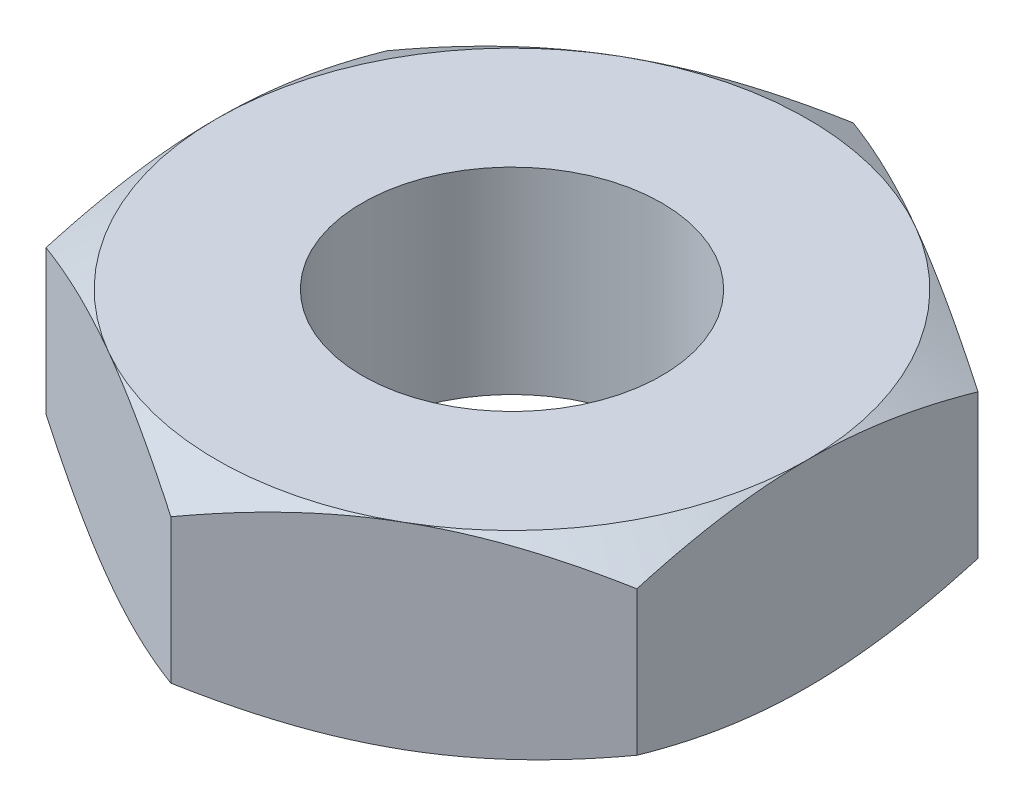
ISO-10303-21;
HEADER;
FILE_DESCRIPTION(('STEP AP214'),'2;1');
FILE_NAME('part.step','',(''),(''),'','','');
FILE_SCHEMA(('AUTOMOTIVE_DESIGN { 1 0 10303 214 1 1 1 1 }'));
ENDSEC;
DATA;
#1=APPLICATION_CONTEXT('core data for automotive mechanical design processes');
#2=APPLICATION_PROTOCOL_DEFINITION('international standard','automotive_design',2000,#1);
#3=PRODUCT_CONTEXT('',#1,'mechanical');
#4=PRODUCT('Part','Part','',(#3));
#5=PRODUCT_RELATED_PRODUCT_CATEGORY('part','',(#4));
#6=PRODUCT_DEFINITION_FORMATION('','',#4);
#7=PRODUCT_DEFINITION_CONTEXT('part definition',#1,'design');
#8=PRODUCT_DEFINITION('design','',#6,#7);
#9=PRODUCT_DEFINITION_SHAPE('','',#8);
#10=(LENGTH_UNIT() NAMED_UNIT(*) SI_UNIT(.MILLI.,.METRE.));
#11=(NAMED_UNIT(*) PLANE_ANGLE_UNIT() SI_UNIT($,.RADIAN.));
#12=(NAMED_UNIT(*) SI_UNIT($,.STERADIAN.) SOLID_ANGLE_UNIT());
#13=UNCERTAINTY_MEASURE_WITH_UNIT(LENGTH_MEASURE(1.E-05),#10,'distance_accuracy_value','');
#14=(GEOMETRIC_REPRESENTATION_CONTEXT(3) GLOBAL_UNCERTAINTY_ASSIGNED_CONTEXT((#13)) GLOBAL_UNIT_ASSIGNED_CONTEXT((#10,
#11,#12)) REPRESENTATION_CONTEXT('',''));
#15=CARTESIAN_POINT('',(0.,0.,0.));
#16=DIRECTION('',(0.,0.,1.));
#17=DIRECTION('',(1.,0.,0.));
#18=AXIS2_PLACEMENT_3D('',#15,#16,#17);
#19=CARTESIAN_POINT('',(-4.7625,1.5875,-2.74963065701559));
#20=DIRECTION('',(0.,1.,0.));
#21=DIRECTION('',(0.,0.,1.));
#22=AXIS2_PLACEMENT_3D('',#19,#20,#21);
#23=PLANE('',#22);
#24=CARTESIAN_POINT('',(0.,1.5875,0.));
#25=DIRECTION('',(0.,1.,0.));
#26=DIRECTION('',(0.,0.,1.));
#27=AXIS2_PLACEMENT_3D('',#24,#25,#26);
#28=CIRCLE('',#27,2.413);
#29=CARTESIAN_POINT('',(0.,1.5875,2.413));
#30=VERTEX_POINT('',#29);
#31=EDGE_CURVE('E259',#30,#30,#28,.T.);
#32=ORIENTED_EDGE('',*,*,#31,.F.);
#33=EDGE_LOOP('',(#32));
#34=FACE_BOUND('',#33,.T.);
#35=CARTESIAN_POINT('',(0.,1.5875,0.));
#36=DIRECTION('',(0.,1.,0.));
#37=DIRECTION('',(0.,0.,1.));
#38=AXIS2_PLACEMENT_3D('',#35,#36,#37);
#39=CIRCLE('',#38,4.7625);
#40=CARTESIAN_POINT('',(-2.38125,1.5875,4.12444598552339));
#41=VERTEX_POINT('',#40);
#42=CARTESIAN_POINT('',(2.38125,1.5875,4.12444598552339));
#43=VERTEX_POINT('',#42);
#44=EDGE_CURVE('E328',#41,#43,#39,.T.);
#45=ORIENTED_EDGE('',*,*,#44,.T.);
#46=CARTESIAN_POINT('',(4.7625,1.5875,0.));
#47=VERTEX_POINT('',#46);
#48=EDGE_CURVE('E332',#43,#47,#39,.T.);
#49=ORIENTED_EDGE('',*,*,#48,.T.);
#50=CARTESIAN_POINT('',(2.38125,1.5875,-4.12444598552339));
#51=VERTEX_POINT('',#50);
#52=EDGE_CURVE('E341',#47,#51,#39,.T.);
#53=ORIENTED_EDGE('',*,*,#52,.T.);
#54=CARTESIAN_POINT('',(-2.38125,1.5875,-4.12444598552339));
#55=VERTEX_POINT('',#54);
#56=EDGE_CURVE('E347',#51,#55,#39,.T.);
#57=ORIENTED_EDGE('',*,*,#56,.T.);
#58=CARTESIAN_POINT('',(-4.7625,1.5875,0.));
#59=VERTEX_POINT('',#58);
#60=EDGE_CURVE('E337',#55,#59,#39,.T.);
#61=ORIENTED_EDGE('',*,*,#60,.T.);
#62=EDGE_CURVE('E331',#59,#41,#39,.T.);
#63=ORIENTED_EDGE('',*,*,#62,.T.);
#64=EDGE_LOOP('',(#45,#49,#53,#57,#61,#63));
#65=FACE_BOUND('',#64,.T.);
#66=ADVANCED_FACE('F41',(#34,#65),#23,.T.);
#67=CARTESIAN_POINT('',(0.,1.5875,-5.49926131403119));
#68=DIRECTION('',(0.5,0.,0.866025403784439));
#69=DIRECTION('',(0.866025403784439,0.,-0.5));
#70=AXIS2_PLACEMENT_3D('',#67,#68,#69);
#71=PLANE('',#70);
#72=DIRECTION('',(0.,-1.,0.));
#73=VECTOR('',#72,1.);
#74=CARTESIAN_POINT('',(0.,1.5875,-5.49926131403119));
#75=LINE('',#74,#73);
#76=CARTESIAN_POINT('',(0.,1.1621306570156,-5.49926131403119));
#77=VERTEX_POINT('',#76);
#78=CARTESIAN_POINT('',(0.,-1.1621306570156,-5.49926131403119));
#79=VERTEX_POINT('',#78);
#80=EDGE_CURVE('E255',#77,#79,#75,.T.);
#81=ORIENTED_EDGE('',*,*,#80,.T.);
#82=CARTESIAN_POINT('',(0.000200000000000045,-1.16206398824923,-5.49937678408502));
#83=CARTESIAN_POINT('',(-0.209097361613879,-1.23184638758606,-5.37853889601657));
#84=CARTESIAN_POINT('',(-0.420184848381229,-1.29531673538478,-5.25666747870888));
#85=CARTESIAN_POINT('',(-0.846014990924114,-1.40610480393128,-5.01081433128269));
#86=CARTESIAN_POINT('',(-1.060765212584,-1.4533833345702,-4.88682823299882));
#87=CARTESIAN_POINT('',(-1.48763695593353,-1.52696647463121,-4.64037371706653));
#88=CARTESIAN_POINT('',(-1.69969199849541,-1.55376120779827,-4.51794368116041));
#89=CARTESIAN_POINT('',(-2.0185205060493,-1.57778887781912,-4.33386795649885));
#90=CARTESIAN_POINT('',(-2.12486940887228,-1.58310535899069,-4.27246738882597));
#91=CARTESIAN_POINT('',(-2.33766550248998,-1.58825983656829,-4.1496095068933));
#92=CARTESIAN_POINT('',(-2.44411269014726,-1.58809800219079,-4.08815219444488));
#93=CARTESIAN_POINT('',(-2.73574948805456,-1.58011505017809,-3.91977561066751));
#94=CARTESIAN_POINT('',(-2.92084246680697,-1.56670757951211,-3.81291212955969));
#95=CARTESIAN_POINT('',(-3.28979997894137,-1.52419213715631,-3.59989441060936));
#96=CARTESIAN_POINT('',(-3.47366321541067,-1.4950696317199,-3.49374092153974));
#97=CARTESIAN_POINT('',(-3.84336411079777,-1.4222707464131,-3.28029401006835));
#98=CARTESIAN_POINT('',(-4.02915510972679,-1.37828588695335,-3.17302752682367));
#99=CARTESIAN_POINT('',(-4.39796626900832,-1.27845772006117,-2.96009430473234));
#100=CARTESIAN_POINT('',(-4.58099115345591,-1.22263786532195,-2.85442483842812));
#101=CARTESIAN_POINT('',(-4.7627,-1.16206398824923,-2.74951518696176));
#102=B_SPLINE_CURVE_WITH_KNOTS('',3,(#82,#83,#84,#85,#86,#87,#88,#89,#90,#91,#92,#93,#94,#95,
#96,#97,#98,#99,#100,#101),.UNSPECIFIED.,.F.,.F.,(4,2,2,2,2,2,2,2,2,4),(0.,0.754910190012917,
1.51163483480638,2.24963134670895,2.61827336240839,2.9869039913527,3.6286742319225,
4.27103902109236,4.92765153591996,5.58297484368455),.UNSPECIFIED.);
#103=CARTESIAN_POINT('',(-2.38125,-1.5875,-4.12444598552339));
#104=VERTEX_POINT('',#103);
#105=EDGE_CURVE('E65',#79,#104,#102,.T.);
#106=ORIENTED_EDGE('',*,*,#105,.T.);
#107=CARTESIAN_POINT('',(-4.7625,-1.16213065701584,-2.74963065701596));
#108=VERTEX_POINT('',#107);
#109=EDGE_CURVE('E206',#104,#108,#102,.T.);
#110=ORIENTED_EDGE('',*,*,#109,.T.);
#111=DIRECTION('',(0.,-1.,0.));
#112=VECTOR('',#111,1.);
#113=CARTESIAN_POINT('',(-4.7625,1.5875,-2.74963065701559));
#114=LINE('',#113,#112);
#115=CARTESIAN_POINT('',(-4.7625,1.16213065701584,-2.74963065701596));
#116=VERTEX_POINT('',#115);
#117=EDGE_CURVE('E238',#116,#108,#114,.T.);
#118=ORIENTED_EDGE('',*,*,#117,.F.);
#119=CARTESIAN_POINT('',(0.000200000000000045,1.16206398824923,-5.49937678408502));
#120=CARTESIAN_POINT('',(-0.209097361613879,1.23184638758606,-5.37853889601657));
#121=CARTESIAN_POINT('',(-0.420184848381229,1.29531673538478,-5.25666747870888));
#122=CARTESIAN_POINT('',(-0.846014990924114,1.40610480393128,-5.01081433128269));
#123=CARTESIAN_POINT('',(-1.060765212584,1.4533833345702,-4.88682823299882));
#124=CARTESIAN_POINT('',(-1.48763695593353,1.52696647463121,-4.64037371706653));
#125=CARTESIAN_POINT('',(-1.69969199849541,1.55376120779827,-4.51794368116041));
#126=CARTESIAN_POINT('',(-2.0185205060493,1.57778887781912,-4.33386795649885));
#127=CARTESIAN_POINT('',(-2.12486940887228,1.58310535899069,-4.27246738882597));
#128=CARTESIAN_POINT('',(-2.33766550248998,1.58825983656829,-4.1496095068933));
#129=CARTESIAN_POINT('',(-2.44411269014726,1.58809800219079,-4.08815219444488));
#130=CARTESIAN_POINT('',(-2.73574948805456,1.58011505017809,-3.91977561066751));
#131=CARTESIAN_POINT('',(-2.92084246680697,1.56670757951211,-3.81291212955969));
#132=CARTESIAN_POINT('',(-3.28979997894137,1.52419213715631,-3.59989441060936));
#133=CARTESIAN_POINT('',(-3.47366321541067,1.4950696317199,-3.49374092153974));
#134=CARTESIAN_POINT('',(-3.84336411079777,1.4222707464131,-3.28029401006835));
#135=CARTESIAN_POINT('',(-4.02915510972679,1.37828588695335,-3.17302752682367));
#136=CARTESIAN_POINT('',(-4.39796626900832,1.27845772006117,-2.96009430473234));
#137=CARTESIAN_POINT('',(-4.58099115345591,1.22263786532195,-2.85442483842812));
#138=CARTESIAN_POINT('',(-4.7627,1.16206398824923,-2.74951518696176));
#139=B_SPLINE_CURVE_WITH_KNOTS('',3,(#119,#120,#121,#122,#123,#124,#125,#126,#127,#128,#129,
#130,#131,#132,#133,#134,#135,#136,#137,#138),.UNSPECIFIED.,.F.,.F.,(4,2,2,2,2,2,2,2,2,4),(0.,
0.754910190012917,1.51163483480638,2.24963134670895,2.61827336240839,2.9869039913527,
3.6286742319225,4.27103902109236,4.92765153591996,5.58297484368455),.UNSPECIFIED.);
#140=EDGE_CURVE('E268',#55,#116,#139,.T.);
#141=ORIENTED_EDGE('',*,*,#140,.F.);
#142=EDGE_CURVE('E264',#77,#55,#139,.T.);
#143=ORIENTED_EDGE('',*,*,#142,.F.);
#144=EDGE_LOOP('',(#81,#106,#110,#118,#141,#143));
#145=FACE_BOUND('',#144,.T.);
#146=ADVANCED_FACE('F43',(#145),#71,.F.);
#147=CARTESIAN_POINT('',(-4.7625,1.5875,-2.74963065701559));
#148=DIRECTION('',(1.,0.,0.));
#149=DIRECTION('',(0.,0.,-1.));
#150=AXIS2_PLACEMENT_3D('',#147,#148,#149);
#151=PLANE('',#150);
#152=ORIENTED_EDGE('',*,*,#117,.T.);
#153=CARTESIAN_POINT('',(-4.7625,0.770257013962998,-7.45485212562883));
#154=CARTESIAN_POINT('',(-4.7625,0.668778986161605,-7.24622579061725));
#155=CARTESIAN_POINT('',(-4.7625,0.568254310912805,-7.03712783121655));
#156=CARTESIAN_POINT('',(-4.7625,0.369646593032791,-6.61773806312633));
#157=CARTESIAN_POINT('',(-4.7625,0.271563922290344,-6.40744607851693));
#158=CARTESIAN_POINT('',(-4.7625,0.0778965161157821,-5.98436725941687));
#159=CARTESIAN_POINT('',(-4.7625,-0.0176723052475696,-5.77157311545513));
#160=CARTESIAN_POINT('',(-4.7625,-0.204989245470332,-5.3443159932951));
#161=CARTESIAN_POINT('',(-4.7625,-0.296737540461697,-5.12985309257119));
#162=CARTESIAN_POINT('',(-4.7625,-0.478361016568282,-4.69179225636152));
#163=CARTESIAN_POINT('',(-4.7625,-0.568074002641515,-4.46812671190972));
#164=CARTESIAN_POINT('',(-4.7625,-0.740875720868389,-4.01820462028808));
#165=CARTESIAN_POINT('',(-4.7625,-0.823963719597704,-3.79194778941001));
#166=CARTESIAN_POINT('',(-4.7625,-0.981385128903754,-3.33688454838713));
#167=CARTESIAN_POINT('',(-4.7625,-1.05573566608417,-3.10808412183808));
#168=CARTESIAN_POINT('',(-4.7625,-1.19334230137798,-2.64720198126561));
#169=CARTESIAN_POINT('',(-4.7625,-1.25660182032578,-2.4151213029292));
#170=CARTESIAN_POINT('',(-4.7625,-1.36870365334152,-1.94881927029473));
#171=CARTESIAN_POINT('',(-4.7625,-1.41762488879476,-1.71461724025521));
#172=CARTESIAN_POINT('',(-4.7625,-1.49832401585872,-1.24323002695387));
#173=CARTESIAN_POINT('',(-4.7625,-1.53010370361079,-1.00604515890871));
#174=CARTESIAN_POINT('',(-4.7625,-1.57357159883869,-0.53300400124907));
#175=CARTESIAN_POINT('',(-4.7625,-1.58552357674839,-0.297172563223946));
#176=CARTESIAN_POINT('',(-4.7625,-1.58902159173336,0.174665244589058));
#177=CARTESIAN_POINT('',(-4.7625,-1.58056723396609,0.410671617673429));
#178=CARTESIAN_POINT('',(-4.7625,-1.54966050358965,0.809265775823325));
#179=CARTESIAN_POINT('',(-4.7625,-1.532269486215,0.972271486764066));
#180=CARTESIAN_POINT('',(-4.7625,-1.48879809224248,1.29712782405562));
#181=CARTESIAN_POINT('',(-4.7625,-1.46271659522586,1.45897829871815));
#182=CARTESIAN_POINT('',(-4.7625,-1.37280332436257,1.94255549981138));
#183=CARTESIAN_POINT('',(-4.7625,-1.29731742570916,2.2621415632871));
#184=CARTESIAN_POINT('',(-4.7625,-1.16591226773456,2.74020920812498));
#185=CARTESIAN_POINT('',(-4.7625,-1.11843848302232,2.90115353860296));
#186=CARTESIAN_POINT('',(-4.7625,-1.01843652374898,3.22147940738853));
#187=CARTESIAN_POINT('',(-4.7625,-0.965908311560225,3.38086093405209));
#188=CARTESIAN_POINT('',(-4.7625,-0.856650816741845,3.69811099151069));
#189=CARTESIAN_POINT('',(-4.7625,-0.79992279027062,3.85597995888228));
#190=CARTESIAN_POINT('',(-4.7625,-0.682945516562269,4.1703999943966));
#191=CARTESIAN_POINT('',(-4.7625,-0.622696341319398,4.32695108941004));
#192=CARTESIAN_POINT('',(-4.7625,-0.459891575360073,4.73837886368964));
#193=CARTESIAN_POINT('',(-4.7625,-0.354864345936092,4.99227643702827));
#194=CARTESIAN_POINT('',(-4.7625,-0.138889932350234,5.4975501143302));
#195=CARTESIAN_POINT('',(-4.7625,-0.0279421609012605,5.7489259652026));
#196=CARTESIAN_POINT('',(-4.7625,0.198506551208655,6.24970729929452));
#197=CARTESIAN_POINT('',(-4.7625,0.314008916787443,6.49911213610851));
#198=CARTESIAN_POINT('',(-4.7625,0.548518488995627,6.99627197323286));
#199=CARTESIAN_POINT('',(-4.7625,0.667525795847275,7.24402692611666));
#200=CARTESIAN_POINT('',(-4.7625,0.908470259732646,7.73855307414476));
#201=CARTESIAN_POINT('',(-4.7625,1.03041144082747,7.9853223047853));
#202=CARTESIAN_POINT('',(-4.7625,1.27650264679452,8.47775804503761));
#203=CARTESIAN_POINT('',(-4.7625,1.40065269429407,8.72342454332082));
#204=CARTESIAN_POINT('',(-4.7625,1.77570563081261,9.45897003901922));
#205=CARTESIAN_POINT('',(-4.7625,2.02926097691712,9.9474960095235));
#206=CARTESIAN_POINT('',(-4.7625,2.51514692049398,10.8725547219695));
#207=CARTESIAN_POINT('',(-4.7625,2.74701832480662,11.3093298093451));
#208=CARTESIAN_POINT('',(-4.7625,3.21360447228271,12.1813890779297));
#209=CARTESIAN_POINT('',(-4.7625,3.44831937313703,12.6166731747205));
#210=CARTESIAN_POINT('',(-4.7625,3.91911738825995,13.4847177134928));
#211=CARTESIAN_POINT('',(-4.7625,4.15519382501271,13.9174817828327));
#212=CARTESIAN_POINT('',(-4.7625,4.62897456700381,14.7820770723121));
#213=CARTESIAN_POINT('',(-4.7625,4.86667875171521,15.2139083584706));
#214=CARTESIAN_POINT('',(-4.7625,5.10497771988735,15.6454090887245));
#215=B_SPLINE_CURVE_WITH_KNOTS('',3,(#153,#154,#155,#156,#157,#158,#159,#160,#161,#162,#163,
#164,#165,#166,#167,#168,#169,#170,#171,#172,#173,#174,#175,#176,#177,#178,#179,#180,#181,#182,
#183,#184,#185,#186,#187,#188,#189,#190,#191,#192,#193,#194,#195,#196,#197,#198,#199,#200,#201,
#202,#203,#204,#205,#206,#207,#208,#209,#210,#211,#212,#213,#214),.UNSPECIFIED.,.F.,.F.,(4,2,2,
2,2,2,2,2,2,2,2,2,2,2,2,2,2,2,2,2,2,2,2,2,2,2,2,2,2,2,4),(0.,0.696000020030552,1.39210539232509,
2.09188434566363,2.7916310023531,3.51451060931451,4.23747013242746,4.95898804714857,
5.68028302904426,6.3975298740074,7.1147015491477,7.82225376903275,8.52981967946731,
9.02137506922982,9.51299385723188,10.4967304001012,11.0000858335407,11.5034450144986,
12.006654245003,12.5098531903672,13.3340317586206,14.15829223364,14.9828126592782,
15.8073566846497,16.6331045940489,17.4588609671717,19.1100361761958,20.5935453649669,
22.0771372042966,23.5560355922623,25.0348256341194),.UNSPECIFIED.);
#216=CARTESIAN_POINT('',(-4.7625,-1.5875,0.));
#217=VERTEX_POINT('',#216);
#218=EDGE_CURVE('E304',#108,#217,#215,.T.);
#219=ORIENTED_EDGE('',*,*,#218,.T.);
#220=CARTESIAN_POINT('',(-4.7625,-1.1621306570156,2.74963065701559));
#221=VERTEX_POINT('',#220);
#222=EDGE_CURVE('E297',#217,#221,#215,.T.);
#223=ORIENTED_EDGE('',*,*,#222,.T.);
#224=DIRECTION('',(0.,-1.,0.));
#225=VECTOR('',#224,1.);
#226=CARTESIAN_POINT('',(-4.7625,1.5875,2.74963065701559));
#227=LINE('',#226,#225);
#228=CARTESIAN_POINT('',(-4.7625,1.1621306570156,2.74963065701559));
#229=VERTEX_POINT('',#228);
#230=EDGE_CURVE('E242',#229,#221,#227,.T.);
#231=ORIENTED_EDGE('',*,*,#230,.F.);
#232=CARTESIAN_POINT('',(-4.7625,-0.770257013962998,-7.45485212562883));
#233=CARTESIAN_POINT('',(-4.7625,-0.668778986161605,-7.24622579061725));
#234=CARTESIAN_POINT('',(-4.7625,-0.568254310912805,-7.03712783121655));
#235=CARTESIAN_POINT('',(-4.7625,-0.369646593032791,-6.61773806312633));
#236=CARTESIAN_POINT('',(-4.7625,-0.271563922290344,-6.40744607851693));
#237=CARTESIAN_POINT('',(-4.7625,-0.0778965161157821,-5.98436725941687));
#238=CARTESIAN_POINT('',(-4.7625,0.0176723052475696,-5.77157311545513));
#239=CARTESIAN_POINT('',(-4.7625,0.204989245470332,-5.3443159932951));
#240=CARTESIAN_POINT('',(-4.7625,0.296737540461697,-5.12985309257119));
#241=CARTESIAN_POINT('',(-4.7625,0.478361016568282,-4.69179225636152));
#242=CARTESIAN_POINT('',(-4.7625,0.568074002641515,-4.46812671190972));
#243=CARTESIAN_POINT('',(-4.7625,0.740875720868389,-4.01820462028808));
#244=CARTESIAN_POINT('',(-4.7625,0.823963719597704,-3.79194778941001));
#245=CARTESIAN_POINT('',(-4.7625,0.981385128903754,-3.33688454838713));
#246=CARTESIAN_POINT('',(-4.7625,1.05573566608417,-3.10808412183808));
#247=CARTESIAN_POINT('',(-4.7625,1.19334230137798,-2.64720198126561));
#248=CARTESIAN_POINT('',(-4.7625,1.25660182032578,-2.4151213029292));
#249=CARTESIAN_POINT('',(-4.7625,1.36870365334152,-1.94881927029473));
#250=CARTESIAN_POINT('',(-4.7625,1.41762488879476,-1.71461724025521));
#251=CARTESIAN_POINT('',(-4.7625,1.49832401585872,-1.24323002695387));
#252=CARTESIAN_POINT('',(-4.7625,1.53010370361079,-1.00604515890871));
#253=CARTESIAN_POINT('',(-4.7625,1.57357159883869,-0.53300400124907));
#254=CARTESIAN_POINT('',(-4.7625,1.58552357674839,-0.297172563223946));
#255=CARTESIAN_POINT('',(-4.7625,1.58902159173336,0.174665244589058));
#256=CARTESIAN_POINT('',(-4.7625,1.58056723396609,0.410671617673429));
#257=CARTESIAN_POINT('',(-4.7625,1.54966050358965,0.809265775823325));
#258=CARTESIAN_POINT('',(-4.7625,1.532269486215,0.972271486764066));
#259=CARTESIAN_POINT('',(-4.7625,1.48879809224248,1.29712782405562));
#260=CARTESIAN_POINT('',(-4.7625,1.46271659522586,1.45897829871815));
#261=CARTESIAN_POINT('',(-4.7625,1.37280332436257,1.94255549981138));
#262=CARTESIAN_POINT('',(-4.7625,1.29731742570916,2.2621415632871));
#263=CARTESIAN_POINT('',(-4.7625,1.16591226773456,2.74020920812498));
#264=CARTESIAN_POINT('',(-4.7625,1.11843848302232,2.90115353860296));
#265=CARTESIAN_POINT('',(-4.7625,1.01843652374898,3.22147940738853));
#266=CARTESIAN_POINT('',(-4.7625,0.965908311560225,3.38086093405209));
#267=CARTESIAN_POINT('',(-4.7625,0.856650816741845,3.69811099151069));
#268=CARTESIAN_POINT('',(-4.7625,0.79992279027062,3.85597995888228));
#269=CARTESIAN_POINT('',(-4.7625,0.682945516562269,4.1703999943966));
#270=CARTESIAN_POINT('',(-4.7625,0.622696341319398,4.32695108941004));
#271=CARTESIAN_POINT('',(-4.7625,0.459891575360073,4.73837886368964));
#272=CARTESIAN_POINT('',(-4.7625,0.354864345936092,4.99227643702827));
#273=CARTESIAN_POINT('',(-4.7625,0.138889932350234,5.4975501143302));
#274=CARTESIAN_POINT('',(-4.7625,0.0279421609012605,5.7489259652026));
#275=CARTESIAN_POINT('',(-4.7625,-0.198506551208655,6.24970729929452));
#276=CARTESIAN_POINT('',(-4.7625,-0.314008916787443,6.49911213610851));
#277=CARTESIAN_POINT('',(-4.7625,-0.548518488995627,6.99627197323286));
#278=CARTESIAN_POINT('',(-4.7625,-0.667525795847275,7.24402692611666));
#279=CARTESIAN_POINT('',(-4.7625,-0.908470259732646,7.73855307414476));
#280=CARTESIAN_POINT('',(-4.7625,-1.03041144082747,7.9853223047853));
#281=CARTESIAN_POINT('',(-4.7625,-1.27650264679452,8.47775804503761));
#282=CARTESIAN_POINT('',(-4.7625,-1.40065269429407,8.72342454332082));
#283=CARTESIAN_POINT('',(-4.7625,-1.77570563081261,9.45897003901922));
#284=CARTESIAN_POINT('',(-4.7625,-2.02926097691712,9.9474960095235));
#285=CARTESIAN_POINT('',(-4.7625,-2.51514692049398,10.8725547219695));
#286=CARTESIAN_POINT('',(-4.7625,-2.74701832480662,11.3093298093451));
#287=CARTESIAN_POINT('',(-4.7625,-3.21360447228271,12.1813890779297));
#288=CARTESIAN_POINT('',(-4.7625,-3.44831937313703,12.6166731747205));
#289=CARTESIAN_POINT('',(-4.7625,-3.91911738825995,13.4847177134928));
#290=CARTESIAN_POINT('',(-4.7625,-4.15519382501271,13.9174817828327));
#291=CARTESIAN_POINT('',(-4.7625,-4.62897456700381,14.7820770723121));
#292=CARTESIAN_POINT('',(-4.7625,-4.86667875171521,15.2139083584706));
#293=CARTESIAN_POINT('',(-4.7625,-5.10497771988735,15.6454090887245));
#294=B_SPLINE_CURVE_WITH_KNOTS('',3,(#232,#233,#234,#235,#236,#237,#238,#239,#240,#241,#242,
#243,#244,#245,#246,#247,#248,#249,#250,#251,#252,#253,#254,#255,#256,#257,#258,#259,#260,#261,
#262,#263,#264,#265,#266,#267,#268,#269,#270,#271,#272,#273,#274,#275,#276,#277,#278,#279,#280,
#281,#282,#283,#284,#285,#286,#287,#288,#289,#290,#291,#292,#293),.UNSPECIFIED.,.F.,.F.,(4,2,2,
2,2,2,2,2,2,2,2,2,2,2,2,2,2,2,2,2,2,2,2,2,2,2,2,2,2,2,4),(0.,0.696000020030552,1.39210539232509,
2.09188434566363,2.7916310023531,3.51451060931451,4.23747013242746,4.95898804714857,
5.68028302904426,6.3975298740074,7.1147015491477,7.82225376903275,8.52981967946731,
9.02137506922982,9.51299385723188,10.4967304001012,11.0000858335407,11.5034450144986,
12.006654245003,12.5098531903672,13.3340317586206,14.15829223364,14.9828126592782,
15.8073566846497,16.6331045940489,17.4588609671717,19.1100361761958,20.5935453649669,
22.0771372042966,23.5560355922623,25.0348256341194),.UNSPECIFIED.);
#295=EDGE_CURVE('E276',#59,#229,#294,.T.);
#296=ORIENTED_EDGE('',*,*,#295,.F.);
#297=EDGE_CURVE('E275',#116,#59,#294,.T.);
#298=ORIENTED_EDGE('',*,*,#297,.F.);
#299=EDGE_LOOP('',(#152,#219,#223,#231,#296,#298));
#300=FACE_BOUND('',#299,.T.);
#301=ADVANCED_FACE('F290',(#300),#151,.F.);
#302=CARTESIAN_POINT('',(-4.7625,1.5875,2.74963065701559));
#303=DIRECTION('',(0.5,0.,-0.866025403784439));
#304=DIRECTION('',(-0.866025403784439,0.,-0.5));
#305=AXIS2_PLACEMENT_3D('',#302,#303,#304);
#306=PLANE('',#305);
#307=ORIENTED_EDGE('',*,*,#230,.T.);
#308=CARTESIAN_POINT('',(-4.7627,-1.16206398824924,2.74951518696175));
#309=CARTESIAN_POINT('',(-4.55340263838612,-1.23184638758606,2.87035307503021));
#310=CARTESIAN_POINT('',(-4.34231515161877,-1.29531673538478,2.9922244923379));
#311=CARTESIAN_POINT('',(-3.91648500907589,-1.40610480393128,3.23807763976409));
#312=CARTESIAN_POINT('',(-3.701734787416,-1.4533833345702,3.36206373804796));
#313=CARTESIAN_POINT('',(-3.27486304406647,-1.52696647463121,3.60851825398025));
#314=CARTESIAN_POINT('',(-3.06280800150459,-1.55376120779827,3.73094828988637));
#315=CARTESIAN_POINT('',(-2.7439794939507,-1.57778887781912,3.91502401454793));
#316=CARTESIAN_POINT('',(-2.63763059112772,-1.58310535899069,3.97642458222081));
#317=CARTESIAN_POINT('',(-2.42483449751002,-1.58825983656829,4.09928246415348));
#318=CARTESIAN_POINT('',(-2.31838730985274,-1.58809800219079,4.16073977660189));
#319=CARTESIAN_POINT('',(-2.02675051194544,-1.58011505017809,4.32911636037927));
#320=CARTESIAN_POINT('',(-1.84165753319303,-1.56670757951211,4.43597984148709));
#321=CARTESIAN_POINT('',(-1.47270002105863,-1.52419213715631,4.64899756043742));
#322=CARTESIAN_POINT('',(-1.28883678458933,-1.4950696317199,4.75515104950704));
#323=CARTESIAN_POINT('',(-0.919135889202234,-1.4222707464131,4.96859796097843));
#324=CARTESIAN_POINT('',(-0.733344890273214,-1.37828588695335,5.07586444422311));
#325=CARTESIAN_POINT('',(-0.364533730991679,-1.27845772006118,5.28879766631444));
#326=CARTESIAN_POINT('',(-0.181508846544092,-1.22263786532195,5.39446713261865));
#327=CARTESIAN_POINT('',(0.000199999999999075,-1.16206398824924,5.49937678408502));
#328=B_SPLINE_CURVE_WITH_KNOTS('',3,(#308,#309,#310,#311,#312,#313,#314,#315,#316,#317,#318,
#319,#320,#321,#322,#323,#324,#325,#326,#327),.UNSPECIFIED.,.F.,.F.,(4,2,2,2,2,2,2,2,2,4),(0.,
0.754910190012917,1.51163483480638,2.24963134670895,2.61827336240839,2.9869039913527,
3.6286742319225,4.27103902109237,4.92765153591996,5.58297484368455),.UNSPECIFIED.);
#329=CARTESIAN_POINT('',(-2.38125,-1.5875,4.12444598552339));
#330=VERTEX_POINT('',#329);
#331=EDGE_CURVE('E171',#221,#330,#328,.T.);
#332=ORIENTED_EDGE('',*,*,#331,.T.);
#333=CARTESIAN_POINT('',(0.,-1.1621306570156,5.49926131403119));
#334=VERTEX_POINT('',#333);
#335=EDGE_CURVE('E151',#330,#334,#328,.T.);
#336=ORIENTED_EDGE('',*,*,#335,.T.);
#337=DIRECTION('',(0.,-1.,0.));
#338=VECTOR('',#337,1.);
#339=CARTESIAN_POINT('',(0.,1.5875,5.49926131403119));
#340=LINE('',#339,#338);
#341=CARTESIAN_POINT('',(0.,1.1621306570156,5.49926131403119));
#342=VERTEX_POINT('',#341);
#343=EDGE_CURVE('E168',#342,#334,#340,.T.);
#344=ORIENTED_EDGE('',*,*,#343,.F.);
#345=CARTESIAN_POINT('',(-4.7627,1.16206398824924,2.74951518696175));
#346=CARTESIAN_POINT('',(-4.55340263838612,1.23184638758606,2.87035307503021));
#347=CARTESIAN_POINT('',(-4.34231515161877,1.29531673538478,2.9922244923379));
#348=CARTESIAN_POINT('',(-3.91648500907589,1.40610480393128,3.23807763976409));
#349=CARTESIAN_POINT('',(-3.701734787416,1.4533833345702,3.36206373804796));
#350=CARTESIAN_POINT('',(-3.27486304406647,1.52696647463121,3.60851825398025));
#351=CARTESIAN_POINT('',(-3.06280800150459,1.55376120779827,3.73094828988637));
#352=CARTESIAN_POINT('',(-2.7439794939507,1.57778887781912,3.91502401454793));
#353=CARTESIAN_POINT('',(-2.63763059112772,1.58310535899069,3.97642458222081));
#354=CARTESIAN_POINT('',(-2.42483449751002,1.58825983656829,4.09928246415348));
#355=CARTESIAN_POINT('',(-2.31838730985274,1.58809800219079,4.16073977660189));
#356=CARTESIAN_POINT('',(-2.02675051194544,1.58011505017809,4.32911636037927));
#357=CARTESIAN_POINT('',(-1.84165753319303,1.56670757951211,4.43597984148709));
#358=CARTESIAN_POINT('',(-1.47270002105863,1.52419213715631,4.64899756043742));
#359=CARTESIAN_POINT('',(-1.28883678458933,1.4950696317199,4.75515104950704));
#360=CARTESIAN_POINT('',(-0.919135889202234,1.4222707464131,4.96859796097843));
#361=CARTESIAN_POINT('',(-0.733344890273214,1.37828588695335,5.07586444422311));
#362=CARTESIAN_POINT('',(-0.364533730991679,1.27845772006118,5.28879766631444));
#363=CARTESIAN_POINT('',(-0.181508846544092,1.22263786532195,5.39446713261865));
#364=CARTESIAN_POINT('',(0.000199999999999075,1.16206398824924,5.49937678408502));
#365=B_SPLINE_CURVE_WITH_KNOTS('',3,(#345,#346,#347,#348,#349,#350,#351,#352,#353,#354,#355,
#356,#357,#358,#359,#360,#361,#362,#363,#364),.UNSPECIFIED.,.F.,.F.,(4,2,2,2,2,2,2,2,2,4),(0.,
0.754910190012917,1.51163483480638,2.24963134670895,2.61827336240839,2.9869039913527,
3.6286742319225,4.27103902109237,4.92765153591996,5.58297484368455),.UNSPECIFIED.);
#366=EDGE_CURVE('E284',#41,#342,#365,.T.);
#367=ORIENTED_EDGE('',*,*,#366,.F.);
#368=EDGE_CURVE('E283',#229,#41,#365,.T.);
#369=ORIENTED_EDGE('',*,*,#368,.F.);
#370=EDGE_LOOP('',(#307,#332,#336,#344,#367,#369));
#371=FACE_BOUND('',#370,.T.);
#372=ADVANCED_FACE('F293',(#371),#306,.F.);
#373=CARTESIAN_POINT('',(0.,1.5875,5.49926131403119));
#374=DIRECTION('',(-0.5,0.,-0.866025403784438));
#375=DIRECTION('',(-0.866025403784438,0.,0.5));
#376=AXIS2_PLACEMENT_3D('',#373,#374,#375);
#377=PLANE('',#376);
#378=ORIENTED_EDGE('',*,*,#343,.T.);
#379=CARTESIAN_POINT('',(-0.000200000000000961,-1.16206398824924,5.49937678408502));
#380=CARTESIAN_POINT('',(0.209097361613878,-1.23184638758606,5.37853889601657));
#381=CARTESIAN_POINT('',(0.420184848381228,-1.29531673538478,5.25666747870888));
#382=CARTESIAN_POINT('',(0.846014990924113,-1.40610480393128,5.01081433128269));
#383=CARTESIAN_POINT('',(1.060765212584,-1.4533833345702,4.88682823299882));
#384=CARTESIAN_POINT('',(1.48763695593353,-1.52696647463122,4.64037371706653));
#385=CARTESIAN_POINT('',(1.69969199849541,-1.55376120779827,4.5179436811604));
#386=CARTESIAN_POINT('',(2.0185205060493,-1.57778887781912,4.33386795649884));
#387=CARTESIAN_POINT('',(2.12486940887228,-1.58310535899069,4.27246738882597));
#388=CARTESIAN_POINT('',(2.33766550248998,-1.58825983656829,4.1496095068933));
#389=CARTESIAN_POINT('',(2.44411269014726,-1.58809800219079,4.08815219444488));
#390=CARTESIAN_POINT('',(2.73574948805456,-1.58011505017809,3.9197756106675));
#391=CARTESIAN_POINT('',(2.92084246680697,-1.56670757951211,3.81291212955969));
#392=CARTESIAN_POINT('',(3.28979997894137,-1.52419213715631,3.59989441060936));
#393=CARTESIAN_POINT('',(3.47366321541067,-1.4950696317199,3.49374092153973));
#394=CARTESIAN_POINT('',(3.84336411079777,-1.4222707464131,3.28029401006835));
#395=CARTESIAN_POINT('',(4.02915510972679,-1.37828588695335,3.17302752682367));
#396=CARTESIAN_POINT('',(4.39796626900832,-1.27845772006118,2.96009430473234));
#397=CARTESIAN_POINT('',(4.58099115345591,-1.22263786532195,2.85442483842812));
#398=CARTESIAN_POINT('',(4.7627,-1.16206398824924,2.74951518696175));
#399=B_SPLINE_CURVE_WITH_KNOTS('',3,(#379,#380,#381,#382,#383,#384,#385,#386,#387,#388,#389,
#390,#391,#392,#393,#394,#395,#396,#397,#398),.UNSPECIFIED.,.F.,.F.,(4,2,2,2,2,2,2,2,2,4),(0.,
0.754910190012917,1.51163483480638,2.24963134670895,2.61827336240839,2.9869039913527,
3.62867423192249,4.27103902109236,4.92765153591996,5.58297484368455),.UNSPECIFIED.);
#400=CARTESIAN_POINT('',(2.38125,-1.5875,4.12444598552339));
#401=VERTEX_POINT('',#400);
#402=EDGE_CURVE('E145',#334,#401,#399,.T.);
#403=ORIENTED_EDGE('',*,*,#402,.T.);
#404=CARTESIAN_POINT('',(4.7625,-1.1621306570156,2.74963065701559));
#405=VERTEX_POINT('',#404);
#406=EDGE_CURVE('E132',#401,#405,#399,.T.);
#407=ORIENTED_EDGE('',*,*,#406,.T.);
#408=DIRECTION('',(0.,-1.,0.));
#409=VECTOR('',#408,1.);
#410=CARTESIAN_POINT('',(4.7625,1.5875,2.74963065701559));
#411=LINE('',#410,#409);
#412=CARTESIAN_POINT('',(4.7625,1.1621306570156,2.74963065701559));
#413=VERTEX_POINT('',#412);
#414=EDGE_CURVE('E248',#413,#405,#411,.T.);
#415=ORIENTED_EDGE('',*,*,#414,.F.);
#416=CARTESIAN_POINT('',(-0.000200000000000961,1.16206398824924,5.49937678408502));
#417=CARTESIAN_POINT('',(0.209097361613878,1.23184638758606,5.37853889601657));
#418=CARTESIAN_POINT('',(0.420184848381228,1.29531673538478,5.25666747870888));
#419=CARTESIAN_POINT('',(0.846014990924113,1.40610480393128,5.01081433128269));
#420=CARTESIAN_POINT('',(1.060765212584,1.4533833345702,4.88682823299882));
#421=CARTESIAN_POINT('',(1.48763695593353,1.52696647463122,4.64037371706653));
#422=CARTESIAN_POINT('',(1.69969199849541,1.55376120779827,4.5179436811604));
#423=CARTESIAN_POINT('',(2.0185205060493,1.57778887781912,4.33386795649884));
#424=CARTESIAN_POINT('',(2.12486940887228,1.58310535899069,4.27246738882597));
#425=CARTESIAN_POINT('',(2.33766550248998,1.58825983656829,4.1496095068933));
#426=CARTESIAN_POINT('',(2.44411269014726,1.58809800219079,4.08815219444488));
#427=CARTESIAN_POINT('',(2.73574948805456,1.58011505017809,3.9197756106675));
#428=CARTESIAN_POINT('',(2.92084246680697,1.56670757951211,3.81291212955969));
#429=CARTESIAN_POINT('',(3.28979997894137,1.52419213715631,3.59989441060936));
#430=CARTESIAN_POINT('',(3.47366321541067,1.4950696317199,3.49374092153973));
#431=CARTESIAN_POINT('',(3.84336411079777,1.4222707464131,3.28029401006835));
#432=CARTESIAN_POINT('',(4.02915510972679,1.37828588695335,3.17302752682367));
#433=CARTESIAN_POINT('',(4.39796626900832,1.27845772006118,2.96009430473234));
#434=CARTESIAN_POINT('',(4.58099115345591,1.22263786532195,2.85442483842812));
#435=CARTESIAN_POINT('',(4.7627,1.16206398824924,2.74951518696175));
#436=B_SPLINE_CURVE_WITH_KNOTS('',3,(#416,#417,#418,#419,#420,#421,#422,#423,#424,#425,#426,
#427,#428,#429,#430,#431,#432,#433,#434,#435),.UNSPECIFIED.,.F.,.F.,(4,2,2,2,2,2,2,2,2,4),(0.,
0.754910190012917,1.51163483480638,2.24963134670895,2.61827336240839,2.9869039913527,
3.62867423192249,4.27103902109236,4.92765153591996,5.58297484368455),.UNSPECIFIED.);
#437=EDGE_CURVE('E367',#43,#413,#436,.T.);
#438=ORIENTED_EDGE('',*,*,#437,.F.);
#439=EDGE_CURVE('E364',#342,#43,#436,.T.);
#440=ORIENTED_EDGE('',*,*,#439,.F.);
#441=EDGE_LOOP('',(#378,#403,#407,#415,#438,#440));
#442=FACE_BOUND('',#441,.T.);
#443=ADVANCED_FACE('F165',(#442),#377,.F.);
#444=CARTESIAN_POINT('',(4.7625,1.5875,2.74963065701559));
#445=DIRECTION('',(-1.,0.,0.));
#446=DIRECTION('',(0.,0.,1.));
#447=AXIS2_PLACEMENT_3D('',#444,#445,#446);
#448=PLANE('',#447);
#449=ORIENTED_EDGE('',*,*,#414,.T.);
#450=CARTESIAN_POINT('',(4.7625,0.770257013165544,-7.45485212398981));
#451=CARTESIAN_POINT('',(4.7625,0.668778985397441,-7.24622578903337));
#452=CARTESIAN_POINT('',(4.7625,0.568254310181914,-7.03712782968787));
#453=CARTESIAN_POINT('',(4.7625,0.369646592368283,-6.6177380617082));
#454=CARTESIAN_POINT('',(4.7625,0.271563921658948,-6.40744607715416));
#455=CARTESIAN_POINT('',(4.7625,0.0778965155506307,-5.98436725816567));
#456=CARTESIAN_POINT('',(4.7625,-0.017672305779593,-5.77157311426014));
#457=CARTESIAN_POINT('',(4.7625,-0.20498924593665,-5.34431599221292));
#458=CARTESIAN_POINT('',(4.7625,-0.296737540895439,-5.12985309154561));
#459=CARTESIAN_POINT('',(4.7625,-0.478361016935956,-4.69179225545347));
#460=CARTESIAN_POINT('',(4.7625,-0.568074002975772,-4.46812671106264));
#461=CARTESIAN_POINT('',(4.7625,-0.740875721137596,-4.01820461956393));
#462=CARTESIAN_POINT('',(4.7625,-0.82396371983528,-3.79194778874781));
#463=CARTESIAN_POINT('',(4.7625,-0.981385129081093,-3.33688454784998));
#464=CARTESIAN_POINT('',(4.7625,-1.05573566623289,-3.10808412136403));
#465=CARTESIAN_POINT('',(4.7625,-1.19334230147415,-2.64720198091947));
#466=CARTESIAN_POINT('',(4.7625,-1.256601820398,-2.41512130264789));
#467=CARTESIAN_POINT('',(4.7625,-1.36870365336542,-1.94881927017635));
#468=CARTESIAN_POINT('',(4.7625,-1.41762488879615,-1.71461724023539));
#469=CARTESIAN_POINT('',(4.7625,-1.49832401582995,-1.24323002713357));
#470=CARTESIAN_POINT('',(4.7625,-1.53010370357438,-1.00604515918936));
#471=CARTESIAN_POINT('',(4.7625,-1.57357159880497,-0.533004001729932));
#472=CARTESIAN_POINT('',(4.7625,-1.58552357672468,-0.297172563804062));
#473=CARTESIAN_POINT('',(4.7625,-1.58902159174699,0.174665243811953));
#474=CARTESIAN_POINT('',(4.7625,-1.58056723400706,0.410671616798591));
#475=CARTESIAN_POINT('',(4.7625,-1.54966050368575,0.809265774825704));
#476=CARTESIAN_POINT('',(4.7625,-1.53226948633297,0.972271485740293));
#477=CARTESIAN_POINT('',(4.7625,-1.48879809240534,1.29712782298071));
#478=CARTESIAN_POINT('',(4.7625,-1.46271659541176,1.45897829761826));
#479=CARTESIAN_POINT('',(4.7625,-1.37280332461803,1.94255549863789));
#480=CARTESIAN_POINT('',(4.7625,-1.29731742601162,2.26214156206647));
#481=CARTESIAN_POINT('',(4.7625,-1.16591226810638,2.74020920683383));
#482=CARTESIAN_POINT('',(4.7625,-1.11843848341742,2.9011535372878));
#483=CARTESIAN_POINT('',(4.7625,-1.01843652418994,3.22147940602562));
#484=CARTESIAN_POINT('',(4.7625,-0.965908312023749,3.38086093266545));
#485=CARTESIAN_POINT('',(4.7625,-0.856650817249706,3.69811099007675));
#486=CARTESIAN_POINT('',(4.7625,-0.799922790800246,3.85597995742477));
#487=CARTESIAN_POINT('',(4.7625,-0.682945517134673,4.17039999289196));
#488=CARTESIAN_POINT('',(4.7625,-0.622696341912815,4.32695108788184));
#489=CARTESIAN_POINT('',(4.7625,-0.459891575988902,4.73837886214747));
#490=CARTESIAN_POINT('',(4.7625,-0.354864346577248,4.99227643549506));
#491=CARTESIAN_POINT('',(4.7625,-0.138889933012585,5.49755011281379));
#492=CARTESIAN_POINT('',(4.7625,-0.0279421615724776,5.74892596369402));
#493=CARTESIAN_POINT('',(4.7625,0.198506550522234,6.24970729780075));
#494=CARTESIAN_POINT('',(4.7625,0.314008916094686,6.49911213462173));
#495=CARTESIAN_POINT('',(4.7625,0.548518488292014,6.99627197175932));
#496=CARTESIAN_POINT('',(4.7625,0.667525795139142,7.24402692464938));
#497=CARTESIAN_POINT('',(4.7625,0.908470259016975,7.73855307268977));
#498=CARTESIAN_POINT('',(4.7625,1.03041144010879,7.98532230333635));
#499=CARTESIAN_POINT('',(4.7625,1.27650264607083,8.47775804360028));
#500=CARTESIAN_POINT('',(4.7625,1.40065269356838,8.72342454188907));
#501=CARTESIAN_POINT('',(4.7625,1.77570563008199,9.45897003760356));
#502=CARTESIAN_POINT('',(4.7625,2.02926097618471,9.94749600811782));
#503=CARTESIAN_POINT('',(4.7625,2.51514691975563,10.8725547205738));
#504=CARTESIAN_POINT('',(4.7625,2.74701832406388,11.3093298079495));
#505=CARTESIAN_POINT('',(4.7625,3.21360447153209,12.1813890765341));
#506=CARTESIAN_POINT('',(4.7625,3.44831937238291,12.6166731733246));
#507=CARTESIAN_POINT('',(4.7625,3.91911738749872,13.4847177120947));
#508=CARTESIAN_POINT('',(4.7625,4.15519382424786,13.9174817814328));
#509=CARTESIAN_POINT('',(4.7625,4.62897456623213,14.782077070908));
#510=CARTESIAN_POINT('',(4.7625,4.86667875094032,15.2139083570643));
#511=CARTESIAN_POINT('',(4.7625,5.10497771910938,15.645409087316));
#512=B_SPLINE_CURVE_WITH_KNOTS('',3,(#450,#451,#452,#453,#454,#455,#456,#457,#458,#459,#460,
#461,#462,#463,#464,#465,#466,#467,#468,#469,#470,#471,#472,#473,#474,#475,#476,#477,#478,#479,
#480,#481,#482,#483,#484,#485,#486,#487,#488,#489,#490,#491,#492,#493,#494,#495,#496,#497,#498,
#499,#500,#501,#502,#503,#504,#505,#506,#507,#508,#509,#510,#511),.UNSPECIFIED.,.F.,.F.,(4,2,2,
2,2,2,2,2,2,2,2,2,2,2,2,2,2,2,2,2,2,2,2,2,2,2,2,2,2,2,4),(0.,0.696000019838075,1.39210539194011,
2.0918843450841,2.79163100157903,3.51451060833337,4.23747013123917,4.95898804575384,
5.68028302744324,6.39752987210376,7.11470154694187,7.8222537665322,8.52981967667189,
9.02137506634945,9.51299385426654,10.4967303969655,11.0000858303162,11.5034450111852,
12.006654241601,12.5098531868766,13.3340317551406,14.1582922301706,14.9828126558199,
15.8073566812024,16.6331045906138,17.4588609637488,19.110036172797,20.5935453615623,
22.0771372008863,23.5560355888417,25.0348256306885),.UNSPECIFIED.);
#513=CARTESIAN_POINT('',(4.7625,-1.5875,0.));
#514=VERTEX_POINT('',#513);
#515=EDGE_CURVE('E139',#405,#514,#512,.F.);
#516=ORIENTED_EDGE('',*,*,#515,.T.);
#517=CARTESIAN_POINT('',(4.7625,-1.1621306570156,-2.7496306570156));
#518=VERTEX_POINT('',#517);
#519=EDGE_CURVE('E180',#514,#518,#512,.F.);
#520=ORIENTED_EDGE('',*,*,#519,.T.);
#521=DIRECTION('',(0.,-1.,0.));
#522=VECTOR('',#521,1.);
#523=CARTESIAN_POINT('',(4.7625,1.5875,-2.7496306570156));
#524=LINE('',#523,#522);
#525=CARTESIAN_POINT('',(4.7625,1.1621306570156,-2.7496306570156));
#526=VERTEX_POINT('',#525);
#527=EDGE_CURVE('E251',#526,#518,#524,.T.);
#528=ORIENTED_EDGE('',*,*,#527,.F.);
#529=CARTESIAN_POINT('',(4.7625,-0.770257013165544,-7.45485212398981));
#530=CARTESIAN_POINT('',(4.7625,-0.668778985397441,-7.24622578903337));
#531=CARTESIAN_POINT('',(4.7625,-0.568254310181914,-7.03712782968787));
#532=CARTESIAN_POINT('',(4.7625,-0.369646592368283,-6.6177380617082));
#533=CARTESIAN_POINT('',(4.7625,-0.271563921658948,-6.40744607715416));
#534=CARTESIAN_POINT('',(4.7625,-0.0778965155506307,-5.98436725816567));
#535=CARTESIAN_POINT('',(4.7625,0.017672305779593,-5.77157311426014));
#536=CARTESIAN_POINT('',(4.7625,0.20498924593665,-5.34431599221292));
#537=CARTESIAN_POINT('',(4.7625,0.296737540895439,-5.12985309154561));
#538=CARTESIAN_POINT('',(4.7625,0.478361016935956,-4.69179225545347));
#539=CARTESIAN_POINT('',(4.7625,0.568074002975772,-4.46812671106264));
#540=CARTESIAN_POINT('',(4.7625,0.740875721137596,-4.01820461956393));
#541=CARTESIAN_POINT('',(4.7625,0.82396371983528,-3.79194778874781));
#542=CARTESIAN_POINT('',(4.7625,0.981385129081093,-3.33688454784998));
#543=CARTESIAN_POINT('',(4.7625,1.05573566623289,-3.10808412136403));
#544=CARTESIAN_POINT('',(4.7625,1.19334230147415,-2.64720198091947));
#545=CARTESIAN_POINT('',(4.7625,1.256601820398,-2.41512130264789));
#546=CARTESIAN_POINT('',(4.7625,1.36870365336542,-1.94881927017635));
#547=CARTESIAN_POINT('',(4.7625,1.41762488879615,-1.71461724023539));
#548=CARTESIAN_POINT('',(4.7625,1.49832401582995,-1.24323002713357));
#549=CARTESIAN_POINT('',(4.7625,1.53010370357438,-1.00604515918936));
#550=CARTESIAN_POINT('',(4.7625,1.57357159880497,-0.533004001729932));
#551=CARTESIAN_POINT('',(4.7625,1.58552357672468,-0.297172563804062));
#552=CARTESIAN_POINT('',(4.7625,1.58902159174699,0.174665243811953));
#553=CARTESIAN_POINT('',(4.7625,1.58056723400706,0.410671616798591));
#554=CARTESIAN_POINT('',(4.7625,1.54966050368575,0.809265774825704));
#555=CARTESIAN_POINT('',(4.7625,1.53226948633297,0.972271485740293));
#556=CARTESIAN_POINT('',(4.7625,1.48879809240534,1.29712782298071));
#557=CARTESIAN_POINT('',(4.7625,1.46271659541176,1.45897829761826));
#558=CARTESIAN_POINT('',(4.7625,1.37280332461803,1.94255549863789));
#559=CARTESIAN_POINT('',(4.7625,1.29731742601162,2.26214156206647));
#560=CARTESIAN_POINT('',(4.7625,1.16591226810638,2.74020920683383));
#561=CARTESIAN_POINT('',(4.7625,1.11843848341742,2.9011535372878));
#562=CARTESIAN_POINT('',(4.7625,1.01843652418994,3.22147940602562));
#563=CARTESIAN_POINT('',(4.7625,0.965908312023749,3.38086093266545));
#564=CARTESIAN_POINT('',(4.7625,0.856650817249706,3.69811099007675));
#565=CARTESIAN_POINT('',(4.7625,0.799922790800246,3.85597995742477));
#566=CARTESIAN_POINT('',(4.7625,0.682945517134673,4.17039999289196));
#567=CARTESIAN_POINT('',(4.7625,0.622696341912815,4.32695108788184));
#568=CARTESIAN_POINT('',(4.7625,0.459891575988902,4.73837886214747));
#569=CARTESIAN_POINT('',(4.7625,0.354864346577248,4.99227643549506));
#570=CARTESIAN_POINT('',(4.7625,0.138889933012585,5.49755011281379));
#571=CARTESIAN_POINT('',(4.7625,0.0279421615724776,5.74892596369402));
#572=CARTESIAN_POINT('',(4.7625,-0.198506550522234,6.24970729780075));
#573=CARTESIAN_POINT('',(4.7625,-0.314008916094686,6.49911213462173));
#574=CARTESIAN_POINT('',(4.7625,-0.548518488292014,6.99627197175932));
#575=CARTESIAN_POINT('',(4.7625,-0.667525795139142,7.24402692464938));
#576=CARTESIAN_POINT('',(4.7625,-0.908470259016975,7.73855307268977));
#577=CARTESIAN_POINT('',(4.7625,-1.03041144010879,7.98532230333635));
#578=CARTESIAN_POINT('',(4.7625,-1.27650264607083,8.47775804360028));
#579=CARTESIAN_POINT('',(4.7625,-1.40065269356838,8.72342454188907));
#580=CARTESIAN_POINT('',(4.7625,-1.77570563008199,9.45897003760356));
#581=CARTESIAN_POINT('',(4.7625,-2.02926097618471,9.94749600811782));
#582=CARTESIAN_POINT('',(4.7625,-2.51514691975563,10.8725547205738));
#583=CARTESIAN_POINT('',(4.7625,-2.74701832406388,11.3093298079495));
#584=CARTESIAN_POINT('',(4.7625,-3.21360447153209,12.1813890765341));
#585=CARTESIAN_POINT('',(4.7625,-3.44831937238291,12.6166731733246));
#586=CARTESIAN_POINT('',(4.7625,-3.91911738749872,13.4847177120947));
#587=CARTESIAN_POINT('',(4.7625,-4.15519382424786,13.9174817814328));
#588=CARTESIAN_POINT('',(4.7625,-4.62897456623213,14.782077070908));
#589=CARTESIAN_POINT('',(4.7625,-4.86667875094032,15.2139083570643));
#590=CARTESIAN_POINT('',(4.7625,-5.10497771910938,15.645409087316));
#591=B_SPLINE_CURVE_WITH_KNOTS('',3,(#529,#530,#531,#532,#533,#534,#535,#536,#537,#538,#539,
#540,#541,#542,#543,#544,#545,#546,#547,#548,#549,#550,#551,#552,#553,#554,#555,#556,#557,#558,
#559,#560,#561,#562,#563,#564,#565,#566,#567,#568,#569,#570,#571,#572,#573,#574,#575,#576,#577,
#578,#579,#580,#581,#582,#583,#584,#585,#586,#587,#588,#589,#590),.UNSPECIFIED.,.F.,.F.,(4,2,2,
2,2,2,2,2,2,2,2,2,2,2,2,2,2,2,2,2,2,2,2,2,2,2,2,2,2,2,4),(0.,0.696000019838075,1.39210539194011,
2.0918843450841,2.79163100157903,3.51451060833337,4.23747013123917,4.95898804575384,
5.68028302744324,6.39752987210376,7.11470154694187,7.8222537665322,8.52981967667189,
9.02137506634945,9.51299385426654,10.4967303969655,11.0000858303162,11.5034450111852,
12.006654241601,12.5098531868766,13.3340317551406,14.1582922301706,14.9828126558199,
15.8073566812024,16.6331045906138,17.4588609637488,19.110036172797,20.5935453615623,
22.0771372008863,23.5560355888417,25.0348256306885),.UNSPECIFIED.);
#592=EDGE_CURVE('E340',#47,#526,#591,.F.);
#593=ORIENTED_EDGE('',*,*,#592,.F.);
#594=EDGE_CURVE('E346',#413,#47,#591,.F.);
#595=ORIENTED_EDGE('',*,*,#594,.F.);
#596=EDGE_LOOP('',(#449,#516,#520,#528,#593,#595));
#597=FACE_BOUND('',#596,.T.);
#598=ADVANCED_FACE('F226',(#597),#448,.F.);
#599=CARTESIAN_POINT('',(4.7625,1.5875,-2.7496306570156));
#600=DIRECTION('',(-0.5,0.,0.866025403784439));
#601=DIRECTION('',(0.866025403784439,0.,0.5));
#602=AXIS2_PLACEMENT_3D('',#599,#600,#601);
#603=PLANE('',#602);
#604=ORIENTED_EDGE('',*,*,#527,.T.);
#605=CARTESIAN_POINT('',(4.7627,-1.16206398824924,-2.74951518696176));
#606=CARTESIAN_POINT('',(4.55340263838612,-1.23184638758606,-2.87035307503021));
#607=CARTESIAN_POINT('',(4.34231515161877,-1.29531673538478,-2.9922244923379));
#608=CARTESIAN_POINT('',(3.91648500907588,-1.40610480393128,-3.23807763976409));
#609=CARTESIAN_POINT('',(3.70173478741599,-1.4533833345702,-3.36206373804796));
#610=CARTESIAN_POINT('',(3.27486304406647,-1.52696647463121,-3.60851825398025));
#611=CARTESIAN_POINT('',(3.06280800150458,-1.55376120779827,-3.73094828988638));
#612=CARTESIAN_POINT('',(2.7439794939507,-1.57778887781912,-3.91502401454794));
#613=CARTESIAN_POINT('',(2.63763059112771,-1.58310535899069,-3.97642458222081));
#614=CARTESIAN_POINT('',(2.42483449751002,-1.58825983656829,-4.09928246415349));
#615=CARTESIAN_POINT('',(2.31838730985274,-1.58809800219079,-4.1607397766019));
#616=CARTESIAN_POINT('',(2.02675051194544,-1.58011505017809,-4.32911636037927));
#617=CARTESIAN_POINT('',(1.84165753319303,-1.56670757951211,-4.43597984148709));
#618=CARTESIAN_POINT('',(1.47270002105863,-1.52419213715631,-4.64899756043742));
#619=CARTESIAN_POINT('',(1.28883678458933,-1.4950696317199,-4.75515104950704));
#620=CARTESIAN_POINT('',(0.919135889202232,-1.4222707464131,-4.96859796097843));
#621=CARTESIAN_POINT('',(0.733344890273212,-1.37828588695335,-5.07586444422311));
#622=CARTESIAN_POINT('',(0.364533730991678,-1.27845772006118,-5.28879766631444));
#623=CARTESIAN_POINT('',(0.181508846544092,-1.22263786532195,-5.39446713261866));
#624=CARTESIAN_POINT('',(-0.000199999999999888,-1.16206398824924,-5.49937678408502));
#625=B_SPLINE_CURVE_WITH_KNOTS('',3,(#605,#606,#607,#608,#609,#610,#611,#612,#613,#614,#615,
#616,#617,#618,#619,#620,#621,#622,#623,#624),.UNSPECIFIED.,.F.,.F.,(4,2,2,2,2,2,2,2,2,4),(0.,
0.754910190012917,1.51163483480638,2.24963134670895,2.61827336240839,2.9869039913527,
3.62867423192249,4.27103902109236,4.92765153591996,5.58297484368455),.UNSPECIFIED.);
#626=CARTESIAN_POINT('',(2.38125,-1.5875,-4.12444598552339));
#627=VERTEX_POINT('',#626);
#628=EDGE_CURVE('E221',#518,#627,#625,.T.);
#629=ORIENTED_EDGE('',*,*,#628,.T.);
#630=EDGE_CURVE('E162',#627,#79,#625,.T.);
#631=ORIENTED_EDGE('',*,*,#630,.T.);
#632=ORIENTED_EDGE('',*,*,#80,.F.);
#633=CARTESIAN_POINT('',(4.7627,1.16206398824924,-2.74951518696176));
#634=CARTESIAN_POINT('',(4.55340263838612,1.23184638758606,-2.87035307503021));
#635=CARTESIAN_POINT('',(4.34231515161877,1.29531673538478,-2.9922244923379));
#636=CARTESIAN_POINT('',(3.91648500907588,1.40610480393128,-3.23807763976409));
#637=CARTESIAN_POINT('',(3.70173478741599,1.4533833345702,-3.36206373804796));
#638=CARTESIAN_POINT('',(3.27486304406647,1.52696647463121,-3.60851825398025));
#639=CARTESIAN_POINT('',(3.06280800150458,1.55376120779827,-3.73094828988638));
#640=CARTESIAN_POINT('',(2.7439794939507,1.57778887781912,-3.91502401454794));
#641=CARTESIAN_POINT('',(2.63763059112771,1.58310535899069,-3.97642458222081));
#642=CARTESIAN_POINT('',(2.42483449751002,1.58825983656829,-4.09928246415349));
#643=CARTESIAN_POINT('',(2.31838730985274,1.58809800219079,-4.1607397766019));
#644=CARTESIAN_POINT('',(2.02675051194544,1.58011505017809,-4.32911636037927));
#645=CARTESIAN_POINT('',(1.84165753319303,1.56670757951211,-4.43597984148709));
#646=CARTESIAN_POINT('',(1.47270002105863,1.52419213715631,-4.64899756043742));
#647=CARTESIAN_POINT('',(1.28883678458933,1.4950696317199,-4.75515104950704));
#648=CARTESIAN_POINT('',(0.919135889202232,1.4222707464131,-4.96859796097843));
#649=CARTESIAN_POINT('',(0.733344890273212,1.37828588695335,-5.07586444422311));
#650=CARTESIAN_POINT('',(0.364533730991678,1.27845772006118,-5.28879766631444));
#651=CARTESIAN_POINT('',(0.181508846544092,1.22263786532195,-5.39446713261866));
#652=CARTESIAN_POINT('',(-0.000199999999999888,1.16206398824924,-5.49937678408502));
#653=B_SPLINE_CURVE_WITH_KNOTS('',3,(#633,#634,#635,#636,#637,#638,#639,#640,#641,#642,#643,
#644,#645,#646,#647,#648,#649,#650,#651,#652),.UNSPECIFIED.,.F.,.F.,(4,2,2,2,2,2,2,2,2,4),(0.,
0.754910190012917,1.51163483480638,2.24963134670895,2.61827336240839,2.9869039913527,
3.62867423192249,4.27103902109236,4.92765153591996,5.58297484368455),.UNSPECIFIED.);
#654=EDGE_CURVE('E231',#51,#77,#653,.T.);
#655=ORIENTED_EDGE('',*,*,#654,.F.);
#656=EDGE_CURVE('E156',#526,#51,#653,.T.);
#657=ORIENTED_EDGE('',*,*,#656,.F.);
#658=EDGE_LOOP('',(#604,#629,#631,#632,#655,#657));
#659=FACE_BOUND('',#658,.T.);
#660=ADVANCED_FACE('F222',(#659),#603,.F.);
#661=CARTESIAN_POINT('',(-4.7625,-1.5875,-2.74963065701559));
#662=DIRECTION('',(0.,1.,0.));
#663=DIRECTION('',(0.,0.,1.));
#664=AXIS2_PLACEMENT_3D('',#661,#662,#663);
#665=PLANE('',#664);
#666=CARTESIAN_POINT('',(0.,-1.5875,0.));
#667=DIRECTION('',(0.,1.,0.));
#668=DIRECTION('',(0.,0.,1.));
#669=AXIS2_PLACEMENT_3D('',#666,#667,#668);
#670=CIRCLE('',#669,4.7625);
#671=EDGE_CURVE('E46',#401,#330,#670,.F.);
#672=ORIENTED_EDGE('',*,*,#671,.T.);
#673=EDGE_CURVE('E12',#330,#217,#670,.F.);
#674=ORIENTED_EDGE('',*,*,#673,.T.);
#675=EDGE_CURVE('E52',#217,#104,#670,.F.);
#676=ORIENTED_EDGE('',*,*,#675,.T.);
#677=EDGE_CURVE('E317',#104,#627,#670,.F.);
#678=ORIENTED_EDGE('',*,*,#677,.T.);
#679=EDGE_CURVE('E155',#627,#514,#670,.F.);
#680=ORIENTED_EDGE('',*,*,#679,.T.);
#681=CARTESIAN_POINT('',(0.,-1.5875,0.));
#682=DIRECTION('',(0.,1.,0.));
#683=DIRECTION('',(0.,0.,1.));
#684=AXIS2_PLACEMENT_3D('',#681,#682,#683);
#685=CIRCLE('',#684,4.7625);
#686=EDGE_CURVE('E136',#401,#514,#685,.T.);
#687=ORIENTED_EDGE('',*,*,#686,.F.);
#688=EDGE_LOOP('',(#672,#674,#676,#678,#680,#687));
#689=FACE_BOUND('',#688,.T.);
#690=CARTESIAN_POINT('',(0.,-1.5875,0.));
#691=DIRECTION('',(0.,1.,0.));
#692=DIRECTION('',(0.,0.,1.));
#693=AXIS2_PLACEMENT_3D('',#690,#691,#692);
#694=CIRCLE('',#693,2.413);
#695=CARTESIAN_POINT('',(0.,-1.5875,2.413));
#696=VERTEX_POINT('',#695);
#697=EDGE_CURVE('E260',#696,#696,#694,.T.);
#698=ORIENTED_EDGE('',*,*,#697,.T.);
#699=EDGE_LOOP('',(#698));
#700=FACE_BOUND('',#699,.T.);
#701=ADVANCED_FACE('F157',(#689,#700),#665,.F.);
#702=CARTESIAN_POINT('',(0.,1.5875,0.));
#703=DIRECTION('',(0.,-1.,0.));
#704=DIRECTION('',(0.,0.,-1.));
#705=AXIS2_PLACEMENT_3D('',#702,#703,#704);
#706=CYLINDRICAL_SURFACE('',#705,2.413);
#707=ORIENTED_EDGE('',*,*,#31,.T.);
#708=EDGE_LOOP('',(#707));
#709=FACE_BOUND('',#708,.T.);
#710=ORIENTED_EDGE('',*,*,#697,.F.);
#711=EDGE_LOOP('',(#710));
#712=FACE_BOUND('',#711,.T.);
#713=ADVANCED_FACE('F412',(#709,#712),#706,.F.);
#714=CARTESIAN_POINT('',(0.,1.5875,0.));
#715=DIRECTION('',(0.,-1.,0.));
#716=DIRECTION('',(0.,0.,1.));
#717=AXIS2_PLACEMENT_3D('',#714,#715,#716);
#718=CONICAL_SURFACE('',#717,4.7625,1.0471975511966);
#719=ORIENTED_EDGE('',*,*,#142,.T.);
#720=ORIENTED_EDGE('',*,*,#56,.F.);
#721=ORIENTED_EDGE('',*,*,#654,.T.);
#722=EDGE_LOOP('',(#719,#720,#721));
#723=FACE_BOUND('',#722,.T.);
#724=ADVANCED_FACE('F200',(#723),#718,.T.);
#725=ORIENTED_EDGE('',*,*,#592,.T.);
#726=ORIENTED_EDGE('',*,*,#656,.T.);
#727=ORIENTED_EDGE('',*,*,#52,.F.);
#728=EDGE_LOOP('',(#725,#726,#727));
#729=FACE_BOUND('',#728,.T.);
#730=ADVANCED_FACE('F387',(#729),#718,.T.);
#731=ORIENTED_EDGE('',*,*,#437,.T.);
#732=ORIENTED_EDGE('',*,*,#594,.T.);
#733=ORIENTED_EDGE('',*,*,#48,.F.);
#734=EDGE_LOOP('',(#731,#732,#733));
#735=FACE_BOUND('',#734,.T.);
#736=ADVANCED_FACE('F381',(#735),#718,.T.);
#737=ORIENTED_EDGE('',*,*,#366,.T.);
#738=ORIENTED_EDGE('',*,*,#439,.T.);
#739=ORIENTED_EDGE('',*,*,#44,.F.);
#740=EDGE_LOOP('',(#737,#738,#739));
#741=FACE_BOUND('',#740,.T.);
#742=ADVANCED_FACE('F397',(#741),#718,.T.);
#743=ORIENTED_EDGE('',*,*,#295,.T.);
#744=ORIENTED_EDGE('',*,*,#368,.T.);
#745=ORIENTED_EDGE('',*,*,#62,.F.);
#746=EDGE_LOOP('',(#743,#744,#745));
#747=FACE_BOUND('',#746,.T.);
#748=ADVANCED_FACE('F400',(#747),#718,.T.);
#749=ORIENTED_EDGE('',*,*,#140,.T.);
#750=ORIENTED_EDGE('',*,*,#297,.T.);
#751=ORIENTED_EDGE('',*,*,#60,.F.);
#752=EDGE_LOOP('',(#749,#750,#751));
#753=FACE_BOUND('',#752,.T.);
#754=ADVANCED_FACE('F354',(#753),#718,.T.);
#755=CARTESIAN_POINT('',(0.,-1.5875,0.));
#756=DIRECTION('',(0.,1.,0.));
#757=DIRECTION('',(0.,0.,1.));
#758=AXIS2_PLACEMENT_3D('',#755,#756,#757);
#759=CONICAL_SURFACE('',#758,4.7625,1.0471975511966);
#760=ORIENTED_EDGE('',*,*,#671,.F.);
#761=ORIENTED_EDGE('',*,*,#402,.F.);
#762=ORIENTED_EDGE('',*,*,#335,.F.);
#763=EDGE_LOOP('',(#760,#761,#762));
#764=FACE_BOUND('',#763,.T.);
#765=ADVANCED_FACE('F149',(#764),#759,.T.);
#766=ORIENTED_EDGE('',*,*,#686,.T.);
#767=ORIENTED_EDGE('',*,*,#515,.F.);
#768=ORIENTED_EDGE('',*,*,#406,.F.);
#769=EDGE_LOOP('',(#766,#767,#768));
#770=FACE_BOUND('',#769,.T.);
#771=ADVANCED_FACE('F134',(#770),#759,.T.);
#772=ORIENTED_EDGE('',*,*,#679,.F.);
#773=ORIENTED_EDGE('',*,*,#628,.F.);
#774=ORIENTED_EDGE('',*,*,#519,.F.);
#775=EDGE_LOOP('',(#772,#773,#774));
#776=FACE_BOUND('',#775,.T.);
#777=ADVANCED_FACE('F199',(#776),#759,.T.);
#778=ORIENTED_EDGE('',*,*,#630,.F.);
#779=ORIENTED_EDGE('',*,*,#677,.F.);
#780=ORIENTED_EDGE('',*,*,#105,.F.);
#781=EDGE_LOOP('',(#778,#779,#780));
#782=FACE_BOUND('',#781,.T.);
#783=ADVANCED_FACE('F194',(#782),#759,.T.);
#784=ORIENTED_EDGE('',*,*,#675,.F.);
#785=ORIENTED_EDGE('',*,*,#218,.F.);
#786=ORIENTED_EDGE('',*,*,#109,.F.);
#787=EDGE_LOOP('',(#784,#785,#786));
#788=FACE_BOUND('',#787,.T.);
#789=ADVANCED_FACE('F198',(#788),#759,.T.);
#790=ORIENTED_EDGE('',*,*,#673,.F.);
#791=ORIENTED_EDGE('',*,*,#331,.F.);
#792=ORIENTED_EDGE('',*,*,#222,.F.);
#793=EDGE_LOOP('',(#790,#791,#792));
#794=FACE_BOUND('',#793,.T.);
#795=ADVANCED_FACE('F311',(#794),#759,.T.);
#796=CLOSED_SHELL('',(#66,#146,#301,#372,#443,#598,#660,#701,#713,#724,#730,#736,#742,#748,#754,
#765,#771,#777,#783,#789,#795));
#797=MANIFOLD_SOLID_BREP('B2',#796);
#798=ADVANCED_BREP_SHAPE_REPRESENTATION('',(#18,#797),#14);
#799=SHAPE_DEFINITION_REPRESENTATION(#9,#798);
ENDSEC;
END-ISO-10303-21;
